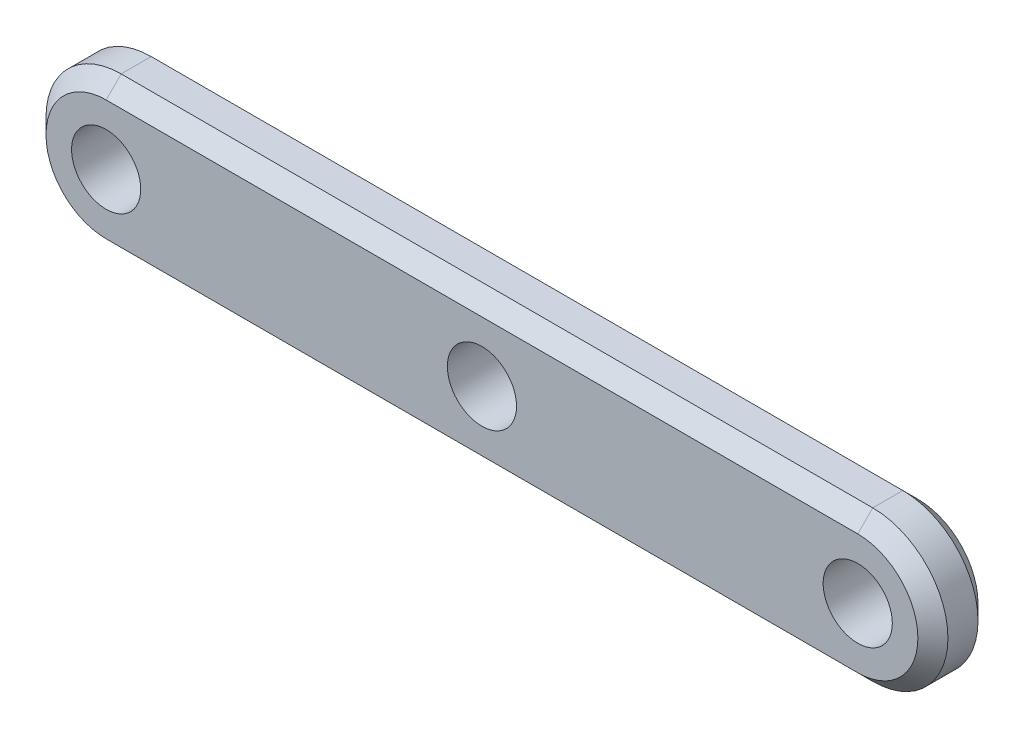
ISO-10303-21;
HEADER;
FILE_DESCRIPTION(('STEP AP214'),'2;1');
FILE_NAME('part.step','',(''),(''),'','','');
FILE_SCHEMA(('AUTOMOTIVE_DESIGN { 1 0 10303 214 1 1 1 1 }'));
ENDSEC;
DATA;
#1=APPLICATION_CONTEXT('core data for automotive mechanical design processes');
#2=APPLICATION_PROTOCOL_DEFINITION('international standard','automotive_design',2000,#1);
#3=PRODUCT_CONTEXT('',#1,'mechanical');
#4=PRODUCT('Part','Part','',(#3));
#5=PRODUCT_RELATED_PRODUCT_CATEGORY('part','',(#4));
#6=PRODUCT_DEFINITION_FORMATION('','',#4);
#7=PRODUCT_DEFINITION_CONTEXT('part definition',#1,'design');
#8=PRODUCT_DEFINITION('design','',#6,#7);
#9=PRODUCT_DEFINITION_SHAPE('','',#8);
#10=(LENGTH_UNIT() NAMED_UNIT(*) SI_UNIT(.MILLI.,.METRE.));
#11=(NAMED_UNIT(*) PLANE_ANGLE_UNIT() SI_UNIT($,.RADIAN.));
#12=(NAMED_UNIT(*) SI_UNIT($,.STERADIAN.) SOLID_ANGLE_UNIT());
#13=UNCERTAINTY_MEASURE_WITH_UNIT(LENGTH_MEASURE(1.E-05),#10,'distance_accuracy_value','');
#14=(GEOMETRIC_REPRESENTATION_CONTEXT(3) GLOBAL_UNCERTAINTY_ASSIGNED_CONTEXT((#13)) GLOBAL_UNIT_ASSIGNED_CONTEXT((#10,
#11,#12)) REPRESENTATION_CONTEXT('',''));
#15=CARTESIAN_POINT('',(0.,0.,0.));
#16=DIRECTION('',(0.,0.,1.));
#17=DIRECTION('',(1.,0.,0.));
#18=AXIS2_PLACEMENT_3D('',#15,#16,#17);
#19=CARTESIAN_POINT('',(0.,-5.,4.));
#20=DIRECTION('',(0.,-1.,0.));
#21=DIRECTION('',(1.,0.,0.));
#22=AXIS2_PLACEMENT_3D('',#19,#20,#21);
#23=PLANE('',#22);
#24=DIRECTION('',(0.,0.,-1.));
#25=VECTOR('',#24,1.);
#26=CARTESIAN_POINT('',(0.,-5.,4.));
#27=LINE('',#26,#25);
#28=CARTESIAN_POINT('',(0.,-5.,3.));
#29=VERTEX_POINT('',#28);
#30=CARTESIAN_POINT('',(0.,-5.,1.));
#31=VERTEX_POINT('',#30);
#32=EDGE_CURVE('E186',#29,#31,#27,.T.);
#33=ORIENTED_EDGE('',*,*,#32,.T.);
#34=DIRECTION('',(1.,0.,0.));
#35=VECTOR('',#34,1.);
#36=CARTESIAN_POINT('',(50.,-5.,1.));
#37=LINE('',#36,#35);
#38=CARTESIAN_POINT('',(50.,-5.,1.));
#39=VERTEX_POINT('',#38);
#40=EDGE_CURVE('E170',#31,#39,#37,.T.);
#41=ORIENTED_EDGE('',*,*,#40,.T.);
#42=DIRECTION('',(0.,0.,-1.));
#43=VECTOR('',#42,1.);
#44=CARTESIAN_POINT('',(50.,-5.,4.));
#45=LINE('',#44,#43);
#46=CARTESIAN_POINT('',(50.,-5.,3.));
#47=VERTEX_POINT('',#46);
#48=EDGE_CURVE('E128',#47,#39,#45,.T.);
#49=ORIENTED_EDGE('',*,*,#48,.F.);
#50=DIRECTION('',(-1.,0.,0.));
#51=VECTOR('',#50,1.);
#52=CARTESIAN_POINT('',(0.,-5.,3.));
#53=LINE('',#52,#51);
#54=EDGE_CURVE('E173',#47,#29,#53,.T.);
#55=ORIENTED_EDGE('',*,*,#54,.T.);
#56=EDGE_LOOP('',(#33,#41,#49,#55));
#57=FACE_BOUND('',#56,.T.);
#58=ADVANCED_FACE('F39',(#57),#23,.T.);
#59=CARTESIAN_POINT('',(50.,0.,4.));
#60=DIRECTION('',(0.,0.,-1.));
#61=DIRECTION('',(-1.,0.,0.));
#62=AXIS2_PLACEMENT_3D('',#59,#60,#61);
#63=CYLINDRICAL_SURFACE('',#62,5.);
#64=ORIENTED_EDGE('',*,*,#48,.T.);
#65=CARTESIAN_POINT('',(50.,0.,1.));
#66=DIRECTION('',(0.,0.,1.));
#67=DIRECTION('',(1.,0.,0.));
#68=AXIS2_PLACEMENT_3D('',#65,#66,#67);
#69=CIRCLE('',#68,5.);
#70=CARTESIAN_POINT('',(50.,5.,1.));
#71=VERTEX_POINT('',#70);
#72=EDGE_CURVE('E163',#39,#71,#69,.T.);
#73=ORIENTED_EDGE('',*,*,#72,.T.);
#74=DIRECTION('',(0.,0.,-1.));
#75=VECTOR('',#74,1.);
#76=CARTESIAN_POINT('',(50.,5.,4.));
#77=LINE('',#76,#75);
#78=CARTESIAN_POINT('',(50.,5.,3.));
#79=VERTEX_POINT('',#78);
#80=EDGE_CURVE('E180',#79,#71,#77,.T.);
#81=ORIENTED_EDGE('',*,*,#80,.F.);
#82=CARTESIAN_POINT('',(50.,0.,3.));
#83=DIRECTION('',(0.,0.,1.));
#84=DIRECTION('',(1.,0.,0.));
#85=AXIS2_PLACEMENT_3D('',#82,#83,#84);
#86=CIRCLE('',#85,5.);
#87=EDGE_CURVE('E165',#79,#47,#86,.F.);
#88=ORIENTED_EDGE('',*,*,#87,.T.);
#89=EDGE_LOOP('',(#64,#73,#81,#88));
#90=FACE_BOUND('',#89,.T.);
#91=ADVANCED_FACE('F233',(#90),#63,.T.);
#92=CARTESIAN_POINT('',(0.,5.,4.));
#93=DIRECTION('',(0.,1.,0.));
#94=DIRECTION('',(-1.,0.,0.));
#95=AXIS2_PLACEMENT_3D('',#92,#93,#94);
#96=PLANE('',#95);
#97=ORIENTED_EDGE('',*,*,#80,.T.);
#98=DIRECTION('',(-1.,0.,0.));
#99=VECTOR('',#98,1.);
#100=CARTESIAN_POINT('',(0.,5.,1.));
#101=LINE('',#100,#99);
#102=CARTESIAN_POINT('',(0.,5.,1.));
#103=VERTEX_POINT('',#102);
#104=EDGE_CURVE('E159',#71,#103,#101,.T.);
#105=ORIENTED_EDGE('',*,*,#104,.T.);
#106=DIRECTION('',(0.,0.,-1.));
#107=VECTOR('',#106,1.);
#108=CARTESIAN_POINT('',(0.,5.,4.));
#109=LINE('',#108,#107);
#110=CARTESIAN_POINT('',(0.,5.,3.));
#111=VERTEX_POINT('',#110);
#112=EDGE_CURVE('E183',#111,#103,#109,.T.);
#113=ORIENTED_EDGE('',*,*,#112,.F.);
#114=DIRECTION('',(1.,0.,0.));
#115=VECTOR('',#114,1.);
#116=CARTESIAN_POINT('',(0.,5.,3.));
#117=LINE('',#116,#115);
#118=EDGE_CURVE('E161',#111,#79,#117,.T.);
#119=ORIENTED_EDGE('',*,*,#118,.T.);
#120=EDGE_LOOP('',(#97,#105,#113,#119));
#121=FACE_BOUND('',#120,.T.);
#122=ADVANCED_FACE('F239',(#121),#96,.T.);
#123=CARTESIAN_POINT('',(50.,0.,4.));
#124=DIRECTION('',(0.,0.,-1.));
#125=DIRECTION('',(-1.,0.,0.));
#126=AXIS2_PLACEMENT_3D('',#123,#124,#125);
#127=CYLINDRICAL_SURFACE('',#126,2.3);
#128=CARTESIAN_POINT('',(50.,0.,4.));
#129=DIRECTION('',(0.,0.,1.));
#130=DIRECTION('',(1.,0.,0.));
#131=AXIS2_PLACEMENT_3D('',#128,#129,#130);
#132=CIRCLE('',#131,2.3);
#133=CARTESIAN_POINT('',(52.3,0.,4.));
#134=VERTEX_POINT('',#133);
#135=EDGE_CURVE('E201',#134,#134,#132,.T.);
#136=ORIENTED_EDGE('',*,*,#135,.T.);
#137=EDGE_LOOP('',(#136));
#138=FACE_BOUND('',#137,.T.);
#139=CARTESIAN_POINT('',(50.,0.,0.));
#140=DIRECTION('',(0.,0.,1.));
#141=DIRECTION('',(1.,0.,0.));
#142=AXIS2_PLACEMENT_3D('',#139,#140,#141);
#143=CIRCLE('',#142,2.3);
#144=CARTESIAN_POINT('',(52.3,0.,0.));
#145=VERTEX_POINT('',#144);
#146=EDGE_CURVE('E194',#145,#145,#143,.T.);
#147=ORIENTED_EDGE('',*,*,#146,.F.);
#148=EDGE_LOOP('',(#147));
#149=FACE_BOUND('',#148,.T.);
#150=ADVANCED_FACE('F281',(#138,#149),#127,.F.);
#151=CARTESIAN_POINT('',(25.,0.,4.));
#152=DIRECTION('',(0.,0.,-1.));
#153=DIRECTION('',(-1.,0.,0.));
#154=AXIS2_PLACEMENT_3D('',#151,#152,#153);
#155=CYLINDRICAL_SURFACE('',#154,2.3);
#156=CARTESIAN_POINT('',(25.,0.,4.));
#157=DIRECTION('',(0.,0.,1.));
#158=DIRECTION('',(1.,0.,0.));
#159=AXIS2_PLACEMENT_3D('',#156,#157,#158);
#160=CIRCLE('',#159,2.3);
#161=CARTESIAN_POINT('',(27.3,0.,4.));
#162=VERTEX_POINT('',#161);
#163=EDGE_CURVE('E193',#162,#162,#160,.T.);
#164=ORIENTED_EDGE('',*,*,#163,.T.);
#165=EDGE_LOOP('',(#164));
#166=FACE_BOUND('',#165,.T.);
#167=CARTESIAN_POINT('',(25.,0.,0.));
#168=DIRECTION('',(0.,0.,1.));
#169=DIRECTION('',(1.,0.,0.));
#170=AXIS2_PLACEMENT_3D('',#167,#168,#169);
#171=CIRCLE('',#170,2.3);
#172=CARTESIAN_POINT('',(27.3,0.,0.));
#173=VERTEX_POINT('',#172);
#174=EDGE_CURVE('E134',#173,#173,#171,.T.);
#175=ORIENTED_EDGE('',*,*,#174,.F.);
#176=EDGE_LOOP('',(#175));
#177=FACE_BOUND('',#176,.T.);
#178=ADVANCED_FACE('F207',(#166,#177),#155,.F.);
#179=CARTESIAN_POINT('',(0.,0.,4.));
#180=DIRECTION('',(0.,0.,-1.));
#181=DIRECTION('',(-1.,0.,0.));
#182=AXIS2_PLACEMENT_3D('',#179,#180,#181);
#183=CYLINDRICAL_SURFACE('',#182,5.);
#184=ORIENTED_EDGE('',*,*,#112,.T.);
#185=CARTESIAN_POINT('',(0.,0.,1.));
#186=DIRECTION('',(0.,0.,1.));
#187=DIRECTION('',(1.,0.,0.));
#188=AXIS2_PLACEMENT_3D('',#185,#186,#187);
#189=CIRCLE('',#188,5.);
#190=EDGE_CURVE('E131',#103,#31,#189,.T.);
#191=ORIENTED_EDGE('',*,*,#190,.T.);
#192=ORIENTED_EDGE('',*,*,#32,.F.);
#193=CARTESIAN_POINT('',(0.,0.,3.));
#194=DIRECTION('',(0.,0.,1.));
#195=DIRECTION('',(1.,0.,0.));
#196=AXIS2_PLACEMENT_3D('',#193,#194,#195);
#197=CIRCLE('',#196,5.);
#198=EDGE_CURVE('E168',#29,#111,#197,.F.);
#199=ORIENTED_EDGE('',*,*,#198,.T.);
#200=EDGE_LOOP('',(#184,#191,#192,#199));
#201=FACE_BOUND('',#200,.T.);
#202=ADVANCED_FACE('F221',(#201),#183,.T.);
#203=CARTESIAN_POINT('',(0.,0.,4.));
#204=DIRECTION('',(0.,0.,-1.));
#205=DIRECTION('',(-1.,0.,0.));
#206=AXIS2_PLACEMENT_3D('',#203,#204,#205);
#207=CYLINDRICAL_SURFACE('',#206,2.3);
#208=CARTESIAN_POINT('',(0.,0.,4.));
#209=DIRECTION('',(0.,0.,1.));
#210=DIRECTION('',(1.,0.,0.));
#211=AXIS2_PLACEMENT_3D('',#208,#209,#210);
#212=CIRCLE('',#211,2.3);
#213=CARTESIAN_POINT('',(2.3,0.,4.));
#214=VERTEX_POINT('',#213);
#215=EDGE_CURVE('E189',#214,#214,#212,.T.);
#216=ORIENTED_EDGE('',*,*,#215,.T.);
#217=EDGE_LOOP('',(#216));
#218=FACE_BOUND('',#217,.T.);
#219=CARTESIAN_POINT('',(0.,0.,0.));
#220=DIRECTION('',(0.,0.,1.));
#221=DIRECTION('',(1.,0.,0.));
#222=AXIS2_PLACEMENT_3D('',#219,#220,#221);
#223=CIRCLE('',#222,2.3);
#224=CARTESIAN_POINT('',(2.3,0.,0.));
#225=VERTEX_POINT('',#224);
#226=EDGE_CURVE('E190',#225,#225,#223,.T.);
#227=ORIENTED_EDGE('',*,*,#226,.F.);
#228=EDGE_LOOP('',(#227));
#229=FACE_BOUND('',#228,.T.);
#230=ADVANCED_FACE('F213',(#218,#229),#207,.F.);
#231=CARTESIAN_POINT('',(0.,0.,4.));
#232=DIRECTION('',(0.,0.,1.));
#233=DIRECTION('',(1.,0.,0.));
#234=AXIS2_PLACEMENT_3D('',#231,#232,#233);
#235=PLANE('',#234);
#236=CARTESIAN_POINT('',(0.,0.,4.));
#237=DIRECTION('',(0.,0.,1.));
#238=DIRECTION('',(1.,0.,0.));
#239=AXIS2_PLACEMENT_3D('',#236,#237,#238);
#240=CIRCLE('',#239,4.);
#241=CARTESIAN_POINT('',(0.,4.,4.));
#242=VERTEX_POINT('',#241);
#243=CARTESIAN_POINT('',(0.,-4.,4.));
#244=VERTEX_POINT('',#243);
#245=EDGE_CURVE('E48',#242,#244,#240,.T.);
#246=ORIENTED_EDGE('',*,*,#245,.T.);
#247=DIRECTION('',(1.,0.,0.));
#248=VECTOR('',#247,1.);
#249=CARTESIAN_POINT('',(0.,-4.,4.));
#250=LINE('',#249,#248);
#251=CARTESIAN_POINT('',(50.,-4.,4.));
#252=VERTEX_POINT('',#251);
#253=EDGE_CURVE('E11',#244,#252,#250,.T.);
#254=ORIENTED_EDGE('',*,*,#253,.T.);
#255=CARTESIAN_POINT('',(50.,0.,4.));
#256=DIRECTION('',(0.,0.,1.));
#257=DIRECTION('',(1.,0.,0.));
#258=AXIS2_PLACEMENT_3D('',#255,#256,#257);
#259=CIRCLE('',#258,4.);
#260=CARTESIAN_POINT('',(50.,4.,4.));
#261=VERTEX_POINT('',#260);
#262=EDGE_CURVE('E155',#252,#261,#259,.T.);
#263=ORIENTED_EDGE('',*,*,#262,.T.);
#264=DIRECTION('',(-1.,0.,0.));
#265=VECTOR('',#264,1.);
#266=CARTESIAN_POINT('',(0.,4.,4.));
#267=LINE('',#266,#265);
#268=EDGE_CURVE('E157',#261,#242,#267,.T.);
#269=ORIENTED_EDGE('',*,*,#268,.T.);
#270=EDGE_LOOP('',(#246,#254,#263,#269));
#271=FACE_BOUND('',#270,.T.);
#272=ORIENTED_EDGE('',*,*,#163,.F.);
#273=EDGE_LOOP('',(#272));
#274=FACE_BOUND('',#273,.T.);
#275=ORIENTED_EDGE('',*,*,#135,.F.);
#276=EDGE_LOOP('',(#275));
#277=FACE_BOUND('',#276,.T.);
#278=ORIENTED_EDGE('',*,*,#215,.F.);
#279=EDGE_LOOP('',(#278));
#280=FACE_BOUND('',#279,.T.);
#281=ADVANCED_FACE('F210',(#271,#274,#277,#280),#235,.T.);
#282=CARTESIAN_POINT('',(0.,0.,0.));
#283=DIRECTION('',(0.,0.,1.));
#284=DIRECTION('',(1.,0.,0.));
#285=AXIS2_PLACEMENT_3D('',#282,#283,#284);
#286=PLANE('',#285);
#287=CARTESIAN_POINT('',(50.,0.,0.));
#288=DIRECTION('',(0.,0.,1.));
#289=DIRECTION('',(1.,0.,0.));
#290=AXIS2_PLACEMENT_3D('',#287,#288,#289);
#291=CIRCLE('',#290,4.);
#292=CARTESIAN_POINT('',(50.,4.,0.));
#293=VERTEX_POINT('',#292);
#294=CARTESIAN_POINT('',(50.,-4.,0.));
#295=VERTEX_POINT('',#294);
#296=EDGE_CURVE('E117',#293,#295,#291,.F.);
#297=ORIENTED_EDGE('',*,*,#296,.T.);
#298=DIRECTION('',(-1.,0.,0.));
#299=VECTOR('',#298,1.);
#300=CARTESIAN_POINT('',(0.,-4.,0.));
#301=LINE('',#300,#299);
#302=CARTESIAN_POINT('',(0.,-4.,0.));
#303=VERTEX_POINT('',#302);
#304=EDGE_CURVE('E113',#295,#303,#301,.T.);
#305=ORIENTED_EDGE('',*,*,#304,.T.);
#306=CARTESIAN_POINT('',(0.,0.,0.));
#307=DIRECTION('',(0.,0.,1.));
#308=DIRECTION('',(1.,0.,0.));
#309=AXIS2_PLACEMENT_3D('',#306,#307,#308);
#310=CIRCLE('',#309,4.);
#311=CARTESIAN_POINT('',(0.,4.,0.));
#312=VERTEX_POINT('',#311);
#313=EDGE_CURVE('E106',#303,#312,#310,.F.);
#314=ORIENTED_EDGE('',*,*,#313,.T.);
#315=DIRECTION('',(1.,0.,0.));
#316=VECTOR('',#315,1.);
#317=CARTESIAN_POINT('',(50.,4.,0.));
#318=LINE('',#317,#316);
#319=EDGE_CURVE('E110',#312,#293,#318,.T.);
#320=ORIENTED_EDGE('',*,*,#319,.T.);
#321=EDGE_LOOP('',(#297,#305,#314,#320));
#322=FACE_BOUND('',#321,.T.);
#323=ORIENTED_EDGE('',*,*,#174,.T.);
#324=EDGE_LOOP('',(#323));
#325=FACE_BOUND('',#324,.T.);
#326=ORIENTED_EDGE('',*,*,#146,.T.);
#327=EDGE_LOOP('',(#326));
#328=FACE_BOUND('',#327,.T.);
#329=ORIENTED_EDGE('',*,*,#226,.T.);
#330=EDGE_LOOP('',(#329));
#331=FACE_BOUND('',#330,.T.);
#332=ADVANCED_FACE('F108',(#322,#325,#328,#331),#286,.F.);
#333=CARTESIAN_POINT('',(0.,4.,0.));
#334=DIRECTION('',(0.,0.707106781186547,-0.707106781186547));
#335=DIRECTION('',(-1.,0.,0.));
#336=AXIS2_PLACEMENT_3D('',#333,#334,#335);
#337=PLANE('',#336);
#338=DIRECTION('',(0.,-0.707106781186547,-0.707106781186547));
#339=VECTOR('',#338,1.);
#340=CARTESIAN_POINT('',(0.,5.,1.));
#341=LINE('',#340,#339);
#342=EDGE_CURVE('E123',#103,#312,#341,.T.);
#343=ORIENTED_EDGE('',*,*,#342,.F.);
#344=ORIENTED_EDGE('',*,*,#104,.F.);
#345=DIRECTION('',(0.,0.707106781186547,0.707106781186547));
#346=VECTOR('',#345,1.);
#347=CARTESIAN_POINT('',(50.,4.,0.));
#348=LINE('',#347,#346);
#349=EDGE_CURVE('E126',#293,#71,#348,.T.);
#350=ORIENTED_EDGE('',*,*,#349,.F.);
#351=ORIENTED_EDGE('',*,*,#319,.F.);
#352=EDGE_LOOP('',(#343,#344,#350,#351));
#353=FACE_BOUND('',#352,.T.);
#354=ADVANCED_FACE('F121',(#353),#337,.T.);
#355=CARTESIAN_POINT('',(50.,0.,1.));
#356=DIRECTION('',(0.,0.,1.));
#357=DIRECTION('',(1.,0.,0.));
#358=AXIS2_PLACEMENT_3D('',#355,#356,#357);
#359=CONICAL_SURFACE('',#358,5.,0.785398163397448);
#360=ORIENTED_EDGE('',*,*,#349,.T.);
#361=ORIENTED_EDGE('',*,*,#72,.F.);
#362=DIRECTION('',(0.,-0.707106781186547,0.707106781186547));
#363=VECTOR('',#362,1.);
#364=CARTESIAN_POINT('',(50.,-4.,0.));
#365=LINE('',#364,#363);
#366=EDGE_CURVE('E132',#295,#39,#365,.T.);
#367=ORIENTED_EDGE('',*,*,#366,.F.);
#368=ORIENTED_EDGE('',*,*,#296,.F.);
#369=EDGE_LOOP('',(#360,#361,#367,#368));
#370=FACE_BOUND('',#369,.T.);
#371=ADVANCED_FACE('F230',(#370),#359,.T.);
#372=CARTESIAN_POINT('',(0.,0.,1.));
#373=DIRECTION('',(0.,0.,1.));
#374=DIRECTION('',(1.,0.,0.));
#375=AXIS2_PLACEMENT_3D('',#372,#373,#374);
#376=CONICAL_SURFACE('',#375,5.,0.785398163397448);
#377=ORIENTED_EDGE('',*,*,#342,.T.);
#378=ORIENTED_EDGE('',*,*,#313,.F.);
#379=DIRECTION('',(0.,0.707106781186547,-0.707106781186547));
#380=VECTOR('',#379,1.);
#381=CARTESIAN_POINT('',(0.,-5.,1.));
#382=LINE('',#381,#380);
#383=EDGE_CURVE('E136',#31,#303,#382,.T.);
#384=ORIENTED_EDGE('',*,*,#383,.F.);
#385=ORIENTED_EDGE('',*,*,#190,.F.);
#386=EDGE_LOOP('',(#377,#378,#384,#385));
#387=FACE_BOUND('',#386,.T.);
#388=ADVANCED_FACE('F130',(#387),#376,.T.);
#389=CARTESIAN_POINT('',(0.,-4.,0.));
#390=DIRECTION('',(0.,-0.707106781186547,-0.707106781186547));
#391=DIRECTION('',(1.,0.,0.));
#392=AXIS2_PLACEMENT_3D('',#389,#390,#391);
#393=PLANE('',#392);
#394=ORIENTED_EDGE('',*,*,#366,.T.);
#395=ORIENTED_EDGE('',*,*,#40,.F.);
#396=ORIENTED_EDGE('',*,*,#383,.T.);
#397=ORIENTED_EDGE('',*,*,#304,.F.);
#398=EDGE_LOOP('',(#394,#395,#396,#397));
#399=FACE_BOUND('',#398,.T.);
#400=ADVANCED_FACE('F244',(#399),#393,.T.);
#401=CARTESIAN_POINT('',(0.,5.,3.));
#402=DIRECTION('',(0.,-0.707106781186547,-0.707106781186547));
#403=DIRECTION('',(1.,0.,0.));
#404=AXIS2_PLACEMENT_3D('',#401,#402,#403);
#405=PLANE('',#404);
#406=DIRECTION('',(0.,0.707106781186547,-0.707106781186547));
#407=VECTOR('',#406,1.);
#408=CARTESIAN_POINT('',(0.,4.,4.));
#409=LINE('',#408,#407);
#410=EDGE_CURVE('E142',#242,#111,#409,.T.);
#411=ORIENTED_EDGE('',*,*,#410,.F.);
#412=ORIENTED_EDGE('',*,*,#268,.F.);
#413=DIRECTION('',(0.,-0.707106781186547,0.707106781186547));
#414=VECTOR('',#413,1.);
#415=CARTESIAN_POINT('',(50.,5.,3.));
#416=LINE('',#415,#414);
#417=EDGE_CURVE('E43',#79,#261,#416,.T.);
#418=ORIENTED_EDGE('',*,*,#417,.F.);
#419=ORIENTED_EDGE('',*,*,#118,.F.);
#420=EDGE_LOOP('',(#411,#412,#418,#419));
#421=FACE_BOUND('',#420,.T.);
#422=ADVANCED_FACE('F41',(#421),#405,.F.);
#423=CARTESIAN_POINT('',(50.,0.,4.));
#424=DIRECTION('',(0.,0.,-1.));
#425=DIRECTION('',(-1.,0.,0.));
#426=AXIS2_PLACEMENT_3D('',#423,#424,#425);
#427=CONICAL_SURFACE('',#426,4.,0.785398163397448);
#428=ORIENTED_EDGE('',*,*,#417,.T.);
#429=ORIENTED_EDGE('',*,*,#262,.F.);
#430=DIRECTION('',(0.,0.707106781186547,0.707106781186547));
#431=VECTOR('',#430,1.);
#432=CARTESIAN_POINT('',(50.,-5.,3.));
#433=LINE('',#432,#431);
#434=EDGE_CURVE('E61',#47,#252,#433,.T.);
#435=ORIENTED_EDGE('',*,*,#434,.F.);
#436=ORIENTED_EDGE('',*,*,#87,.F.);
#437=EDGE_LOOP('',(#428,#429,#435,#436));
#438=FACE_BOUND('',#437,.T.);
#439=ADVANCED_FACE('F257',(#438),#427,.T.);
#440=CARTESIAN_POINT('',(0.,0.,4.));
#441=DIRECTION('',(0.,0.,-1.));
#442=DIRECTION('',(-1.,0.,0.));
#443=AXIS2_PLACEMENT_3D('',#440,#441,#442);
#444=CONICAL_SURFACE('',#443,4.,0.785398163397448);
#445=ORIENTED_EDGE('',*,*,#410,.T.);
#446=ORIENTED_EDGE('',*,*,#198,.F.);
#447=DIRECTION('',(0.,-0.707106781186547,-0.707106781186547));
#448=VECTOR('',#447,1.);
#449=CARTESIAN_POINT('',(0.,-4.,4.));
#450=LINE('',#449,#448);
#451=EDGE_CURVE('E140',#244,#29,#450,.T.);
#452=ORIENTED_EDGE('',*,*,#451,.F.);
#453=ORIENTED_EDGE('',*,*,#245,.F.);
#454=EDGE_LOOP('',(#445,#446,#452,#453));
#455=FACE_BOUND('',#454,.T.);
#456=ADVANCED_FACE('F255',(#455),#444,.T.);
#457=CARTESIAN_POINT('',(0.,-5.,3.));
#458=DIRECTION('',(0.,0.707106781186547,-0.707106781186547));
#459=DIRECTION('',(-1.,0.,0.));
#460=AXIS2_PLACEMENT_3D('',#457,#458,#459);
#461=PLANE('',#460);
#462=ORIENTED_EDGE('',*,*,#434,.T.);
#463=ORIENTED_EDGE('',*,*,#253,.F.);
#464=ORIENTED_EDGE('',*,*,#451,.T.);
#465=ORIENTED_EDGE('',*,*,#54,.F.);
#466=EDGE_LOOP('',(#462,#463,#464,#465));
#467=FACE_BOUND('',#466,.T.);
#468=ADVANCED_FACE('F252',(#467),#461,.F.);
#469=CLOSED_SHELL('',(#58,#91,#122,#150,#178,#202,#230,#281,#332,#354,#371,#388,#400,#422,#439,
#456,#468));
#470=MANIFOLD_SOLID_BREP('B2',#469);
#471=ADVANCED_BREP_SHAPE_REPRESENTATION('',(#18,#470),#14);
#472=SHAPE_DEFINITION_REPRESENTATION(#9,#471);
ENDSEC;
END-ISO-10303-21;
